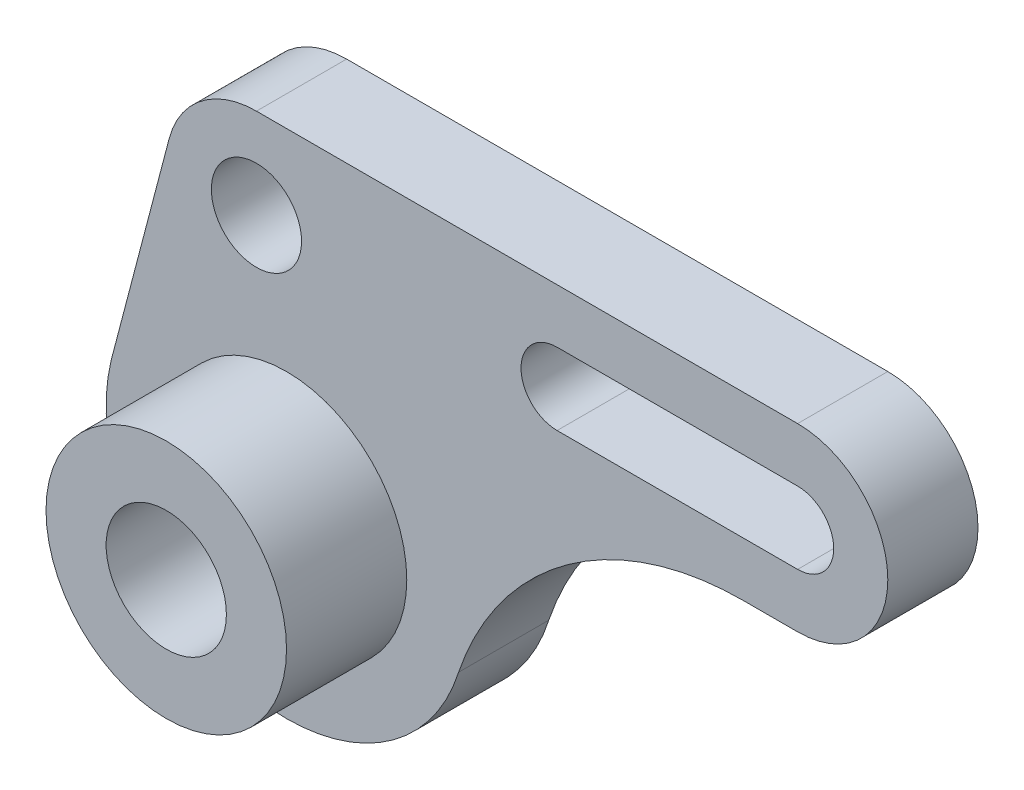
ISO-10303-21;
HEADER;
FILE_DESCRIPTION(('STEP AP214'),'2;1');
FILE_NAME('part.step','',(''),(''),'','','');
FILE_SCHEMA(('AUTOMOTIVE_DESIGN { 1 0 10303 214 1 1 1 1 }'));
ENDSEC;
DATA;
#1=APPLICATION_CONTEXT('core data for automotive mechanical design processes');
#2=APPLICATION_PROTOCOL_DEFINITION('international standard','automotive_design',2000,#1);
#3=PRODUCT_CONTEXT('',#1,'mechanical');
#4=PRODUCT('Part','Part','',(#3));
#5=PRODUCT_RELATED_PRODUCT_CATEGORY('part','',(#4));
#6=PRODUCT_DEFINITION_FORMATION('','',#4);
#7=PRODUCT_DEFINITION_CONTEXT('part definition',#1,'design');
#8=PRODUCT_DEFINITION('design','',#6,#7);
#9=PRODUCT_DEFINITION_SHAPE('','',#8);
#10=(LENGTH_UNIT() NAMED_UNIT(*) SI_UNIT(.MILLI.,.METRE.));
#11=(NAMED_UNIT(*) PLANE_ANGLE_UNIT() SI_UNIT($,.RADIAN.));
#12=(NAMED_UNIT(*) SI_UNIT($,.STERADIAN.) SOLID_ANGLE_UNIT());
#13=UNCERTAINTY_MEASURE_WITH_UNIT(LENGTH_MEASURE(1.E-05),#10,'distance_accuracy_value','');
#14=(GEOMETRIC_REPRESENTATION_CONTEXT(3) GLOBAL_UNCERTAINTY_ASSIGNED_CONTEXT((#13)) GLOBAL_UNIT_ASSIGNED_CONTEXT((#10,
#11,#12)) REPRESENTATION_CONTEXT('',''));
#15=CARTESIAN_POINT('',(0.,0.,0.));
#16=DIRECTION('',(0.,0.,1.));
#17=DIRECTION('',(1.,0.,0.));
#18=AXIS2_PLACEMENT_3D('',#15,#16,#17);
#19=CARTESIAN_POINT('',(-29.9039916859465,4.83141927153272,35.));
#20=DIRECTION('',(0.,0.,-1.));
#21=DIRECTION('',(-1.,0.,0.));
#22=AXIS2_PLACEMENT_3D('',#19,#20,#21);
#23=CYLINDRICAL_SURFACE('',#22,20.);
#24=CARTESIAN_POINT('',(-29.9039916859465,4.83141927153272,15.));
#25=DIRECTION('',(0.,0.,1.));
#26=DIRECTION('',(1.,0.,0.));
#27=AXIS2_PLACEMENT_3D('',#24,#25,#26);
#28=CIRCLE('',#27,20.);
#29=CARTESIAN_POINT('',(-9.90399168594654,4.83141927153272,15.));
#30=VERTEX_POINT('',#29);
#31=EDGE_CURVE('E188',#30,#30,#28,.T.);
#32=ORIENTED_EDGE('',*,*,#31,.T.);
#33=EDGE_LOOP('',(#32));
#34=FACE_BOUND('',#33,.T.);
#35=CARTESIAN_POINT('',(-29.9039916859465,4.83141927153272,35.));
#36=DIRECTION('',(0.,0.,1.));
#37=DIRECTION('',(1.,0.,0.));
#38=AXIS2_PLACEMENT_3D('',#35,#36,#37);
#39=CIRCLE('',#38,20.);
#40=CARTESIAN_POINT('',(-9.90399168594654,4.83141927153272,35.));
#41=VERTEX_POINT('',#40);
#42=EDGE_CURVE('E11',#41,#41,#39,.T.);
#43=ORIENTED_EDGE('',*,*,#42,.F.);
#44=EDGE_LOOP('',(#43));
#45=FACE_BOUND('',#44,.T.);
#46=ADVANCED_FACE('F37',(#34,#45),#23,.T.);
#47=CARTESIAN_POINT('',(-29.9039916859465,4.83141927153272,35.));
#48=DIRECTION('',(0.,0.,1.));
#49=DIRECTION('',(1.,0.,0.));
#50=AXIS2_PLACEMENT_3D('',#47,#48,#49);
#51=PLANE('',#50);
#52=CARTESIAN_POINT('',(-29.9039916859465,4.83141927153272,35.));
#53=DIRECTION('',(0.,0.,1.));
#54=DIRECTION('',(1.,0.,0.));
#55=AXIS2_PLACEMENT_3D('',#52,#53,#54);
#56=CIRCLE('',#55,10.);
#57=CARTESIAN_POINT('',(-19.9039916859465,4.83141927153272,35.));
#58=VERTEX_POINT('',#57);
#59=EDGE_CURVE('E159',#58,#58,#56,.T.);
#60=ORIENTED_EDGE('',*,*,#59,.F.);
#61=EDGE_LOOP('',(#60));
#62=FACE_BOUND('',#61,.T.);
#63=ORIENTED_EDGE('',*,*,#42,.T.);
#64=EDGE_LOOP('',(#63));
#65=FACE_BOUND('',#64,.T.);
#66=ADVANCED_FACE('F256',(#62,#65),#51,.T.);
#67=CARTESIAN_POINT('',(-58.1724089675102,15.2716199371919,15.));
#68=DIRECTION('',(-0.967225401451459,0.253919323382573,0.));
#69=DIRECTION('',(-0.253919323382573,-0.967225401451459,0.));
#70=AXIS2_PLACEMENT_3D('',#67,#68,#69);
#71=PLANE('',#70);
#72=DIRECTION('',(0.253919323382573,0.967225401451459,0.));
#73=VECTOR('',#72,1.);
#74=CARTESIAN_POINT('',(-58.1724089675102,15.2716199371919,0.));
#75=LINE('',#74,#73);
#76=CARTESIAN_POINT('',(-59.0796070170604,11.8159357222881,0.));
#77=VERTEX_POINT('',#76);
#78=CARTESIAN_POINT('',(-49.4123727077184,48.6402091222713,0.));
#79=VERTEX_POINT('',#78);
#80=EDGE_CURVE('E171',#77,#79,#75,.T.);
#81=ORIENTED_EDGE('',*,*,#80,.F.);
#82=DIRECTION('',(0.,0.,-1.));
#83=VECTOR('',#82,1.);
#84=CARTESIAN_POINT('',(-59.0796070170604,11.8159357222881,15.));
#85=LINE('',#84,#83);
#86=CARTESIAN_POINT('',(-59.0796070170604,11.8159357222881,15.));
#87=VERTEX_POINT('',#86);
#88=EDGE_CURVE('E45',#87,#77,#85,.T.);
#89=ORIENTED_EDGE('',*,*,#88,.F.);
#90=DIRECTION('',(0.253919323382573,0.967225401451459,0.));
#91=VECTOR('',#90,1.);
#92=CARTESIAN_POINT('',(-58.1724089675102,15.2716199371919,15.));
#93=LINE('',#92,#91);
#94=CARTESIAN_POINT('',(-49.4123727077184,48.6402091222713,15.));
#95=VERTEX_POINT('',#94);
#96=EDGE_CURVE('E230',#87,#95,#93,.T.);
#97=ORIENTED_EDGE('',*,*,#96,.T.);
#98=DIRECTION('',(0.,0.,-1.));
#99=VECTOR('',#98,1.);
#100=CARTESIAN_POINT('',(-49.4123727077184,48.6402091222713,15.));
#101=LINE('',#100,#99);
#102=EDGE_CURVE('E97',#95,#79,#101,.T.);
#103=ORIENTED_EDGE('',*,*,#102,.T.);
#104=EDGE_LOOP('',(#81,#89,#97,#103));
#105=FACE_BOUND('',#104,.T.);
#106=ADVANCED_FACE('F261',(#105),#71,.T.);
#107=CARTESIAN_POINT('',(-29.9039916859465,4.83141927153272,15.));
#108=DIRECTION('',(0.,0.,-1.));
#109=DIRECTION('',(-1.,0.,0.));
#110=AXIS2_PLACEMENT_3D('',#107,#108,#109);
#111=CYLINDRICAL_SURFACE('',#110,30.);
#112=CARTESIAN_POINT('',(-29.9039916859465,4.83141927153272,0.));
#113=DIRECTION('',(0.,0.,1.));
#114=DIRECTION('',(1.,0.,0.));
#115=AXIS2_PLACEMENT_3D('',#112,#113,#114);
#116=CIRCLE('',#115,30.);
#117=CARTESIAN_POINT('',(-1.28938346022626,-4.17991781507884,0.));
#118=VERTEX_POINT('',#117);
#119=EDGE_CURVE('E174',#77,#118,#116,.T.);
#120=ORIENTED_EDGE('',*,*,#119,.T.);
#121=DIRECTION('',(0.,0.,-1.));
#122=VECTOR('',#121,1.);
#123=CARTESIAN_POINT('',(-1.28938346022626,-4.17991781507884,15.));
#124=LINE('',#123,#122);
#125=CARTESIAN_POINT('',(-1.28938346022626,-4.17991781507884,15.));
#126=VERTEX_POINT('',#125);
#127=EDGE_CURVE('E194',#126,#118,#124,.T.);
#128=ORIENTED_EDGE('',*,*,#127,.F.);
#129=CARTESIAN_POINT('',(-29.9039916859465,4.83141927153272,15.));
#130=DIRECTION('',(0.,0.,1.));
#131=DIRECTION('',(1.,0.,0.));
#132=AXIS2_PLACEMENT_3D('',#129,#130,#131);
#133=CIRCLE('',#132,30.);
#134=EDGE_CURVE('E232',#87,#126,#133,.T.);
#135=ORIENTED_EDGE('',*,*,#134,.F.);
#136=ORIENTED_EDGE('',*,*,#88,.T.);
#137=EDGE_LOOP('',(#120,#128,#135,#136));
#138=FACE_BOUND('',#137,.T.);
#139=ADVANCED_FACE('F242',(#138),#111,.T.);
#140=CARTESIAN_POINT('',(46.0853213751818,-20.1685807284673,15.));
#141=DIRECTION('',(0.,0.,-1.));
#142=DIRECTION('',(-1.,0.,0.));
#143=AXIS2_PLACEMENT_3D('',#140,#141,#142);
#144=CYLINDRICAL_SURFACE('',#143,50.);
#145=CARTESIAN_POINT('',(46.0853213751818,-20.1685807284673,0.));
#146=DIRECTION('',(0.,0.,1.));
#147=DIRECTION('',(1.,0.,0.));
#148=AXIS2_PLACEMENT_3D('',#145,#146,#147);
#149=CIRCLE('',#148,50.);
#150=CARTESIAN_POINT('',(46.0853213751818,29.8314192715327,0.));
#151=VERTEX_POINT('',#150);
#152=EDGE_CURVE('E177',#151,#118,#149,.T.);
#153=ORIENTED_EDGE('',*,*,#152,.F.);
#154=DIRECTION('',(0.,0.,-1.));
#155=VECTOR('',#154,1.);
#156=CARTESIAN_POINT('',(46.0853213751818,29.8314192715327,15.));
#157=LINE('',#156,#155);
#158=CARTESIAN_POINT('',(46.0853213751818,29.8314192715327,15.));
#159=VERTEX_POINT('',#158);
#160=EDGE_CURVE('E192',#159,#151,#157,.T.);
#161=ORIENTED_EDGE('',*,*,#160,.F.);
#162=CARTESIAN_POINT('',(46.0853213751818,-20.1685807284673,15.));
#163=DIRECTION('',(0.,0.,1.));
#164=DIRECTION('',(1.,0.,0.));
#165=AXIS2_PLACEMENT_3D('',#162,#163,#164);
#166=CIRCLE('',#165,50.);
#167=EDGE_CURVE('E234',#159,#126,#166,.T.);
#168=ORIENTED_EDGE('',*,*,#167,.T.);
#169=ORIENTED_EDGE('',*,*,#127,.T.);
#170=EDGE_LOOP('',(#153,#161,#168,#169));
#171=FACE_BOUND('',#170,.T.);
#172=ADVANCED_FACE('F238',(#171),#144,.F.);
#173=CARTESIAN_POINT('',(0.,29.8314192715327,15.));
#174=DIRECTION('',(0.,1.,0.));
#175=DIRECTION('',(0.,0.,1.));
#176=AXIS2_PLACEMENT_3D('',#173,#174,#175);
#177=PLANE('',#176);
#178=DIRECTION('',(1.,0.,0.));
#179=VECTOR('',#178,1.);
#180=CARTESIAN_POINT('',(0.,29.8314192715327,0.));
#181=LINE('',#180,#179);
#182=CARTESIAN_POINT('',(55.0960083140535,29.8314192715327,0.));
#183=VERTEX_POINT('',#182);
#184=EDGE_CURVE('E180',#151,#183,#181,.T.);
#185=ORIENTED_EDGE('',*,*,#184,.T.);
#186=DIRECTION('',(0.,0.,-1.));
#187=VECTOR('',#186,1.);
#188=CARTESIAN_POINT('',(55.0960083140535,29.8314192715327,15.));
#189=LINE('',#188,#187);
#190=CARTESIAN_POINT('',(55.0960083140535,29.8314192715327,15.));
#191=VERTEX_POINT('',#190);
#192=EDGE_CURVE('E147',#191,#183,#189,.T.);
#193=ORIENTED_EDGE('',*,*,#192,.F.);
#194=DIRECTION('',(1.,0.,0.));
#195=VECTOR('',#194,1.);
#196=CARTESIAN_POINT('',(0.,29.8314192715327,15.));
#197=LINE('',#196,#195);
#198=EDGE_CURVE('E135',#159,#191,#197,.T.);
#199=ORIENTED_EDGE('',*,*,#198,.F.);
#200=ORIENTED_EDGE('',*,*,#160,.T.);
#201=EDGE_LOOP('',(#185,#193,#199,#200));
#202=FACE_BOUND('',#201,.T.);
#203=ADVANCED_FACE('F246',(#202),#177,.F.);
#204=CARTESIAN_POINT('',(55.0960083140535,44.8314192715327,15.));
#205=DIRECTION('',(0.,0.,-1.));
#206=DIRECTION('',(-1.,0.,0.));
#207=AXIS2_PLACEMENT_3D('',#204,#205,#206);
#208=CYLINDRICAL_SURFACE('',#207,15.);
#209=CARTESIAN_POINT('',(55.0960083140535,44.8314192715327,0.));
#210=DIRECTION('',(0.,0.,1.));
#211=DIRECTION('',(1.,0.,0.));
#212=AXIS2_PLACEMENT_3D('',#209,#210,#211);
#213=CIRCLE('',#212,15.);
#214=CARTESIAN_POINT('',(55.0960083140535,59.8314192715327,0.));
#215=VERTEX_POINT('',#214);
#216=EDGE_CURVE('E143',#183,#215,#213,.T.);
#217=ORIENTED_EDGE('',*,*,#216,.T.);
#218=DIRECTION('',(0.,0.,-1.));
#219=VECTOR('',#218,1.);
#220=CARTESIAN_POINT('',(55.0960083140535,59.8314192715327,15.));
#221=LINE('',#220,#219);
#222=CARTESIAN_POINT('',(55.0960083140535,59.8314192715327,15.));
#223=VERTEX_POINT('',#222);
#224=EDGE_CURVE('E141',#223,#215,#221,.T.);
#225=ORIENTED_EDGE('',*,*,#224,.F.);
#226=CARTESIAN_POINT('',(55.0960083140535,44.8314192715327,15.));
#227=DIRECTION('',(0.,0.,1.));
#228=DIRECTION('',(1.,0.,0.));
#229=AXIS2_PLACEMENT_3D('',#226,#227,#228);
#230=CIRCLE('',#229,15.);
#231=EDGE_CURVE('E128',#191,#223,#230,.T.);
#232=ORIENTED_EDGE('',*,*,#231,.F.);
#233=ORIENTED_EDGE('',*,*,#192,.T.);
#234=EDGE_LOOP('',(#217,#225,#232,#233));
#235=FACE_BOUND('',#234,.T.);
#236=ADVANCED_FACE('F142',(#235),#208,.T.);
#237=CARTESIAN_POINT('',(0.,59.8314192715327,15.));
#238=DIRECTION('',(0.,1.,0.));
#239=DIRECTION('',(0.,0.,1.));
#240=AXIS2_PLACEMENT_3D('',#237,#238,#239);
#241=PLANE('',#240);
#242=DIRECTION('',(1.,0.,0.));
#243=VECTOR('',#242,1.);
#244=CARTESIAN_POINT('',(0.,59.8314192715327,0.));
#245=LINE('',#244,#243);
#246=CARTESIAN_POINT('',(-34.9039916859465,59.8314192715327,0.));
#247=VERTEX_POINT('',#246);
#248=EDGE_CURVE('E184',#247,#215,#245,.T.);
#249=ORIENTED_EDGE('',*,*,#248,.F.);
#250=DIRECTION('',(0.,0.,-1.));
#251=VECTOR('',#250,1.);
#252=CARTESIAN_POINT('',(-34.9039916859465,59.8314192715327,15.));
#253=LINE('',#252,#251);
#254=CARTESIAN_POINT('',(-34.9039916859465,59.8314192715327,15.));
#255=VERTEX_POINT('',#254);
#256=EDGE_CURVE('E90',#255,#247,#253,.T.);
#257=ORIENTED_EDGE('',*,*,#256,.F.);
#258=DIRECTION('',(1.,0.,0.));
#259=VECTOR('',#258,1.);
#260=CARTESIAN_POINT('',(0.,59.8314192715327,15.));
#261=LINE('',#260,#259);
#262=EDGE_CURVE('E132',#255,#223,#261,.T.);
#263=ORIENTED_EDGE('',*,*,#262,.T.);
#264=ORIENTED_EDGE('',*,*,#224,.T.);
#265=EDGE_LOOP('',(#249,#257,#263,#264));
#266=FACE_BOUND('',#265,.T.);
#267=ADVANCED_FACE('F149',(#266),#241,.T.);
#268=CARTESIAN_POINT('',(55.0960083140535,44.8314192715327,15.));
#269=DIRECTION('',(0.,0.,-1.));
#270=DIRECTION('',(-1.,0.,0.));
#271=AXIS2_PLACEMENT_3D('',#268,#269,#270);
#272=CYLINDRICAL_SURFACE('',#271,6.);
#273=CARTESIAN_POINT('',(55.0960083140535,44.8314192715327,0.));
#274=DIRECTION('',(0.,0.,1.));
#275=DIRECTION('',(1.,0.,0.));
#276=AXIS2_PLACEMENT_3D('',#273,#274,#275);
#277=CIRCLE('',#276,6.);
#278=CARTESIAN_POINT('',(55.0960083140535,38.8314192715327,0.));
#279=VERTEX_POINT('',#278);
#280=CARTESIAN_POINT('',(55.0960083140535,50.8314192715327,0.));
#281=VERTEX_POINT('',#280);
#282=EDGE_CURVE('E158',#279,#281,#277,.T.);
#283=ORIENTED_EDGE('',*,*,#282,.F.);
#284=DIRECTION('',(0.,0.,-1.));
#285=VECTOR('',#284,1.);
#286=CARTESIAN_POINT('',(55.0960083140535,38.8314192715327,15.));
#287=LINE('',#286,#285);
#288=CARTESIAN_POINT('',(55.0960083140535,38.8314192715327,15.));
#289=VERTEX_POINT('',#288);
#290=EDGE_CURVE('E104',#289,#279,#287,.T.);
#291=ORIENTED_EDGE('',*,*,#290,.F.);
#292=CARTESIAN_POINT('',(55.0960083140535,44.8314192715327,15.));
#293=DIRECTION('',(0.,0.,1.));
#294=DIRECTION('',(1.,0.,0.));
#295=AXIS2_PLACEMENT_3D('',#292,#293,#294);
#296=CIRCLE('',#295,6.);
#297=CARTESIAN_POINT('',(55.0960083140535,50.8314192715327,15.));
#298=VERTEX_POINT('',#297);
#299=EDGE_CURVE('E221',#289,#298,#296,.T.);
#300=ORIENTED_EDGE('',*,*,#299,.T.);
#301=DIRECTION('',(0.,0.,-1.));
#302=VECTOR('',#301,1.);
#303=CARTESIAN_POINT('',(55.0960083140535,50.8314192715327,15.));
#304=LINE('',#303,#302);
#305=EDGE_CURVE('E151',#298,#281,#304,.T.);
#306=ORIENTED_EDGE('',*,*,#305,.T.);
#307=EDGE_LOOP('',(#283,#291,#300,#306));
#308=FACE_BOUND('',#307,.T.);
#309=ADVANCED_FACE('F207',(#308),#272,.F.);
#310=CARTESIAN_POINT('',(0.,38.8314192715327,15.));
#311=DIRECTION('',(0.,1.,0.));
#312=DIRECTION('',(0.,0.,1.));
#313=AXIS2_PLACEMENT_3D('',#310,#311,#312);
#314=PLANE('',#313);
#315=DIRECTION('',(1.,0.,0.));
#316=VECTOR('',#315,1.);
#317=CARTESIAN_POINT('',(0.,38.8314192715327,0.));
#318=LINE('',#317,#316);
#319=CARTESIAN_POINT('',(15.0960083140535,38.8314192715327,0.));
#320=VERTEX_POINT('',#319);
#321=EDGE_CURVE('E162',#320,#279,#318,.T.);
#322=ORIENTED_EDGE('',*,*,#321,.F.);
#323=DIRECTION('',(0.,0.,-1.));
#324=VECTOR('',#323,1.);
#325=CARTESIAN_POINT('',(15.0960083140535,38.8314192715327,15.));
#326=LINE('',#325,#324);
#327=CARTESIAN_POINT('',(15.0960083140535,38.8314192715327,15.));
#328=VERTEX_POINT('',#327);
#329=EDGE_CURVE('E200',#328,#320,#326,.T.);
#330=ORIENTED_EDGE('',*,*,#329,.F.);
#331=DIRECTION('',(1.,0.,0.));
#332=VECTOR('',#331,1.);
#333=CARTESIAN_POINT('',(0.,38.8314192715327,15.));
#334=LINE('',#333,#332);
#335=EDGE_CURVE('E206',#328,#289,#334,.T.);
#336=ORIENTED_EDGE('',*,*,#335,.T.);
#337=ORIENTED_EDGE('',*,*,#290,.T.);
#338=EDGE_LOOP('',(#322,#330,#336,#337));
#339=FACE_BOUND('',#338,.T.);
#340=ADVANCED_FACE('F204',(#339),#314,.T.);
#341=CARTESIAN_POINT('',(15.0960083140535,44.8314192715327,15.));
#342=DIRECTION('',(0.,0.,-1.));
#343=DIRECTION('',(-1.,0.,0.));
#344=AXIS2_PLACEMENT_3D('',#341,#342,#343);
#345=CYLINDRICAL_SURFACE('',#344,6.);
#346=CARTESIAN_POINT('',(15.0960083140535,44.8314192715327,0.));
#347=DIRECTION('',(0.,0.,1.));
#348=DIRECTION('',(1.,0.,0.));
#349=AXIS2_PLACEMENT_3D('',#346,#347,#348);
#350=CIRCLE('',#349,6.);
#351=CARTESIAN_POINT('',(15.0960083140535,50.8314192715327,0.));
#352=VERTEX_POINT('',#351);
#353=EDGE_CURVE('E165',#352,#320,#350,.T.);
#354=ORIENTED_EDGE('',*,*,#353,.F.);
#355=DIRECTION('',(0.,0.,-1.));
#356=VECTOR('',#355,1.);
#357=CARTESIAN_POINT('',(15.0960083140535,50.8314192715327,15.));
#358=LINE('',#357,#356);
#359=CARTESIAN_POINT('',(15.0960083140535,50.8314192715327,15.));
#360=VERTEX_POINT('',#359);
#361=EDGE_CURVE('E198',#360,#352,#358,.T.);
#362=ORIENTED_EDGE('',*,*,#361,.F.);
#363=CARTESIAN_POINT('',(15.0960083140535,44.8314192715327,15.));
#364=DIRECTION('',(0.,0.,1.));
#365=DIRECTION('',(1.,0.,0.));
#366=AXIS2_PLACEMENT_3D('',#363,#364,#365);
#367=CIRCLE('',#366,6.);
#368=EDGE_CURVE('E219',#360,#328,#367,.T.);
#369=ORIENTED_EDGE('',*,*,#368,.T.);
#370=ORIENTED_EDGE('',*,*,#329,.T.);
#371=EDGE_LOOP('',(#354,#362,#369,#370));
#372=FACE_BOUND('',#371,.T.);
#373=ADVANCED_FACE('F215',(#372),#345,.F.);
#374=CARTESIAN_POINT('',(0.,50.8314192715327,15.));
#375=DIRECTION('',(0.,1.,0.));
#376=DIRECTION('',(0.,0.,1.));
#377=AXIS2_PLACEMENT_3D('',#374,#375,#376);
#378=PLANE('',#377);
#379=DIRECTION('',(1.,0.,0.));
#380=VECTOR('',#379,1.);
#381=CARTESIAN_POINT('',(0.,50.8314192715327,0.));
#382=LINE('',#381,#380);
#383=EDGE_CURVE('E168',#352,#281,#382,.T.);
#384=ORIENTED_EDGE('',*,*,#383,.T.);
#385=ORIENTED_EDGE('',*,*,#305,.F.);
#386=DIRECTION('',(1.,0.,0.));
#387=VECTOR('',#386,1.);
#388=CARTESIAN_POINT('',(0.,50.8314192715327,15.));
#389=LINE('',#388,#387);
#390=EDGE_CURVE('E223',#360,#298,#389,.T.);
#391=ORIENTED_EDGE('',*,*,#390,.F.);
#392=ORIENTED_EDGE('',*,*,#361,.T.);
#393=EDGE_LOOP('',(#384,#385,#391,#392));
#394=FACE_BOUND('',#393,.T.);
#395=ADVANCED_FACE('F292',(#394),#378,.F.);
#396=CARTESIAN_POINT('',(-34.9039916859465,44.8314192715327,15.));
#397=DIRECTION('',(0.,0.,-1.));
#398=DIRECTION('',(-1.,0.,0.));
#399=AXIS2_PLACEMENT_3D('',#396,#397,#398);
#400=CYLINDRICAL_SURFACE('',#399,7.5);
#401=CARTESIAN_POINT('',(-34.9039916859465,44.8314192715327,15.));
#402=DIRECTION('',(0.,0.,1.));
#403=DIRECTION('',(1.,0.,0.));
#404=AXIS2_PLACEMENT_3D('',#401,#402,#403);
#405=CIRCLE('',#404,7.5);
#406=CARTESIAN_POINT('',(-27.4039916859465,44.8314192715327,15.));
#407=VERTEX_POINT('',#406);
#408=EDGE_CURVE('E225',#407,#407,#405,.T.);
#409=ORIENTED_EDGE('',*,*,#408,.T.);
#410=EDGE_LOOP('',(#409));
#411=FACE_BOUND('',#410,.T.);
#412=CARTESIAN_POINT('',(-34.9039916859465,44.8314192715327,0.));
#413=DIRECTION('',(0.,0.,1.));
#414=DIRECTION('',(1.,0.,0.));
#415=AXIS2_PLACEMENT_3D('',#412,#413,#414);
#416=CIRCLE('',#415,7.5);
#417=CARTESIAN_POINT('',(-27.4039916859465,44.8314192715327,0.));
#418=VERTEX_POINT('',#417);
#419=EDGE_CURVE('E155',#418,#418,#416,.T.);
#420=ORIENTED_EDGE('',*,*,#419,.F.);
#421=EDGE_LOOP('',(#420));
#422=FACE_BOUND('',#421,.T.);
#423=ADVANCED_FACE('F289',(#411,#422),#400,.F.);
#424=CARTESIAN_POINT('',(-34.9039916859465,44.8314192715327,15.));
#425=DIRECTION('',(0.,0.,-1.));
#426=DIRECTION('',(-1.,0.,0.));
#427=AXIS2_PLACEMENT_3D('',#424,#425,#426);
#428=CYLINDRICAL_SURFACE('',#427,15.);
#429=CARTESIAN_POINT('',(-34.9039916859465,44.8314192715327,0.));
#430=DIRECTION('',(0.,0.,1.));
#431=DIRECTION('',(1.,0.,0.));
#432=AXIS2_PLACEMENT_3D('',#429,#430,#431);
#433=CIRCLE('',#432,15.);
#434=EDGE_CURVE('E186',#247,#79,#433,.T.);
#435=ORIENTED_EDGE('',*,*,#434,.T.);
#436=ORIENTED_EDGE('',*,*,#102,.F.);
#437=CARTESIAN_POINT('',(-34.9039916859465,44.8314192715327,15.));
#438=DIRECTION('',(0.,0.,1.));
#439=DIRECTION('',(1.,0.,0.));
#440=AXIS2_PLACEMENT_3D('',#437,#438,#439);
#441=CIRCLE('',#440,15.);
#442=EDGE_CURVE('E53',#255,#95,#441,.T.);
#443=ORIENTED_EDGE('',*,*,#442,.F.);
#444=ORIENTED_EDGE('',*,*,#256,.T.);
#445=EDGE_LOOP('',(#435,#436,#443,#444));
#446=FACE_BOUND('',#445,.T.);
#447=ADVANCED_FACE('F291',(#446),#428,.T.);
#448=CARTESIAN_POINT('',(0.,0.,15.));
#449=DIRECTION('',(0.,0.,1.));
#450=DIRECTION('',(1.,0.,0.));
#451=AXIS2_PLACEMENT_3D('',#448,#449,#450);
#452=PLANE('',#451);
#453=ORIENTED_EDGE('',*,*,#31,.F.);
#454=EDGE_LOOP('',(#453));
#455=FACE_BOUND('',#454,.T.);
#456=ORIENTED_EDGE('',*,*,#408,.F.);
#457=EDGE_LOOP('',(#456));
#458=FACE_BOUND('',#457,.T.);
#459=ORIENTED_EDGE('',*,*,#299,.F.);
#460=ORIENTED_EDGE('',*,*,#335,.F.);
#461=ORIENTED_EDGE('',*,*,#368,.F.);
#462=ORIENTED_EDGE('',*,*,#390,.T.);
#463=EDGE_LOOP('',(#459,#460,#461,#462));
#464=FACE_BOUND('',#463,.T.);
#465=ORIENTED_EDGE('',*,*,#96,.F.);
#466=ORIENTED_EDGE('',*,*,#134,.T.);
#467=ORIENTED_EDGE('',*,*,#167,.F.);
#468=ORIENTED_EDGE('',*,*,#198,.T.);
#469=ORIENTED_EDGE('',*,*,#231,.T.);
#470=ORIENTED_EDGE('',*,*,#262,.F.);
#471=ORIENTED_EDGE('',*,*,#442,.T.);
#472=EDGE_LOOP('',(#465,#466,#467,#468,#469,#470,#471));
#473=FACE_BOUND('',#472,.T.);
#474=ADVANCED_FACE('F130',(#455,#458,#464,#473),#452,.T.);
#475=CARTESIAN_POINT('',(-29.9039916859465,4.83141927153272,0.));
#476=DIRECTION('',(0.,0.,1.));
#477=DIRECTION('',(1.,0.,0.));
#478=AXIS2_PLACEMENT_3D('',#475,#476,#477);
#479=PLANE('',#478);
#480=CARTESIAN_POINT('',(-29.9039916859465,4.83141927153272,0.));
#481=DIRECTION('',(0.,0.,1.));
#482=DIRECTION('',(1.,0.,0.));
#483=AXIS2_PLACEMENT_3D('',#480,#481,#482);
#484=CIRCLE('',#483,10.);
#485=CARTESIAN_POINT('',(-19.9039916859465,4.83141927153272,0.));
#486=VERTEX_POINT('',#485);
#487=EDGE_CURVE('E273',#486,#486,#484,.T.);
#488=ORIENTED_EDGE('',*,*,#487,.T.);
#489=EDGE_LOOP('',(#488));
#490=FACE_BOUND('',#489,.T.);
#491=ORIENTED_EDGE('',*,*,#419,.T.);
#492=EDGE_LOOP('',(#491));
#493=FACE_BOUND('',#492,.T.);
#494=ORIENTED_EDGE('',*,*,#282,.T.);
#495=ORIENTED_EDGE('',*,*,#383,.F.);
#496=ORIENTED_EDGE('',*,*,#353,.T.);
#497=ORIENTED_EDGE('',*,*,#321,.T.);
#498=EDGE_LOOP('',(#494,#495,#496,#497));
#499=FACE_BOUND('',#498,.T.);
#500=ORIENTED_EDGE('',*,*,#80,.T.);
#501=ORIENTED_EDGE('',*,*,#434,.F.);
#502=ORIENTED_EDGE('',*,*,#248,.T.);
#503=ORIENTED_EDGE('',*,*,#216,.F.);
#504=ORIENTED_EDGE('',*,*,#184,.F.);
#505=ORIENTED_EDGE('',*,*,#152,.T.);
#506=ORIENTED_EDGE('',*,*,#119,.F.);
#507=EDGE_LOOP('',(#500,#501,#502,#503,#504,#505,#506));
#508=FACE_BOUND('',#507,.T.);
#509=ADVANCED_FACE('F211',(#490,#493,#499,#508),#479,.F.);
#510=CARTESIAN_POINT('',(-29.9039916859465,4.83141927153272,35.));
#511=DIRECTION('',(0.,0.,-1.));
#512=DIRECTION('',(-1.,0.,0.));
#513=AXIS2_PLACEMENT_3D('',#510,#511,#512);
#514=CYLINDRICAL_SURFACE('',#513,10.);
#515=ORIENTED_EDGE('',*,*,#59,.T.);
#516=EDGE_LOOP('',(#515));
#517=FACE_BOUND('',#516,.T.);
#518=ORIENTED_EDGE('',*,*,#487,.F.);
#519=EDGE_LOOP('',(#518));
#520=FACE_BOUND('',#519,.T.);
#521=ADVANCED_FACE('F279',(#517,#520),#514,.F.);
#522=CLOSED_SHELL('',(#46,#66,#106,#139,#172,#203,#236,#267,#309,#340,#373,#395,#423,#447,#474,
#509,#521));
#523=MANIFOLD_SOLID_BREP('B2',#522);
#524=ADVANCED_BREP_SHAPE_REPRESENTATION('',(#18,#523),#14);
#525=SHAPE_DEFINITION_REPRESENTATION(#9,#524);
ENDSEC;
END-ISO-10303-21;
